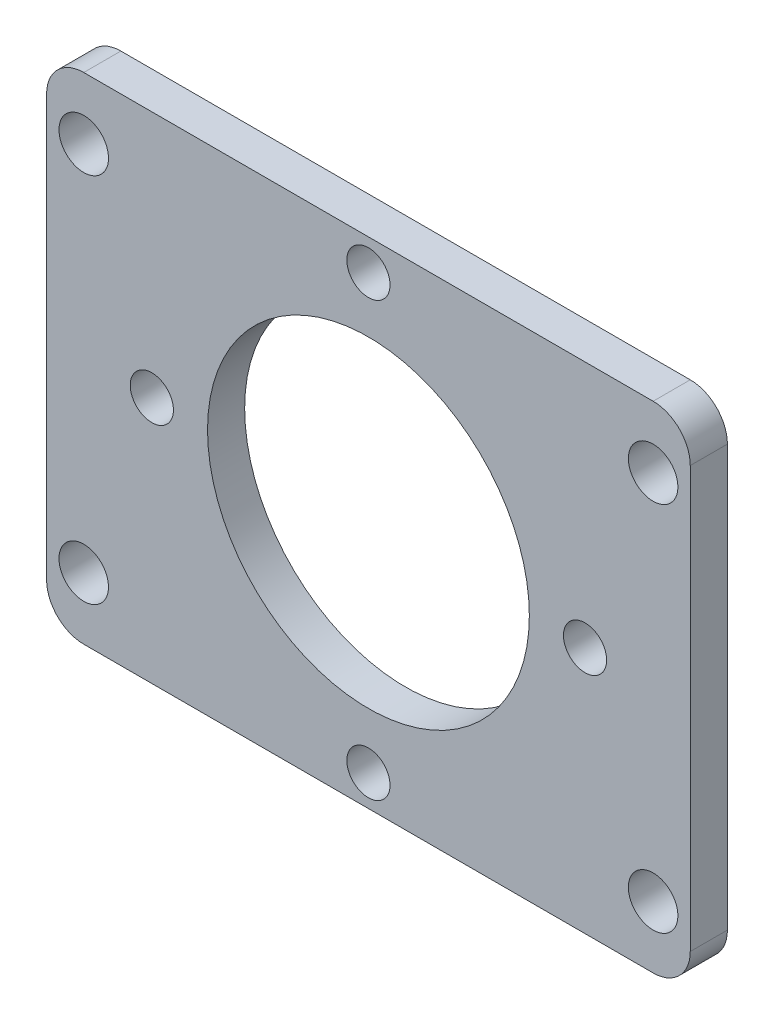
ISO-10303-21;
HEADER;
FILE_DESCRIPTION(('STEP AP214'),'2;1');
FILE_NAME('part.step','',(''),(''),'','','');
FILE_SCHEMA(('AUTOMOTIVE_DESIGN { 1 0 10303 214 1 1 1 1 }'));
ENDSEC;
DATA;
#1=APPLICATION_CONTEXT('core data for automotive mechanical design processes');
#2=APPLICATION_PROTOCOL_DEFINITION('international standard','automotive_design',2000,#1);
#3=PRODUCT_CONTEXT('',#1,'mechanical');
#4=PRODUCT('Part','Part','',(#3));
#5=PRODUCT_RELATED_PRODUCT_CATEGORY('part','',(#4));
#6=PRODUCT_DEFINITION_FORMATION('','',#4);
#7=PRODUCT_DEFINITION_CONTEXT('part definition',#1,'design');
#8=PRODUCT_DEFINITION('design','',#6,#7);
#9=PRODUCT_DEFINITION_SHAPE('','',#8);
#10=(LENGTH_UNIT() NAMED_UNIT(*) SI_UNIT(.MILLI.,.METRE.));
#11=(NAMED_UNIT(*) PLANE_ANGLE_UNIT() SI_UNIT($,.RADIAN.));
#12=(NAMED_UNIT(*) SI_UNIT($,.STERADIAN.) SOLID_ANGLE_UNIT());
#13=UNCERTAINTY_MEASURE_WITH_UNIT(LENGTH_MEASURE(1.E-05),#10,'distance_accuracy_value','');
#14=(GEOMETRIC_REPRESENTATION_CONTEXT(3) GLOBAL_UNCERTAINTY_ASSIGNED_CONTEXT((#13)) GLOBAL_UNIT_ASSIGNED_CONTEXT((#10,
#11,#12)) REPRESENTATION_CONTEXT('',''));
#15=CARTESIAN_POINT('',(0.,0.,0.));
#16=DIRECTION('',(0.,0.,1.));
#17=DIRECTION('',(1.,0.,0.));
#18=AXIS2_PLACEMENT_3D('',#15,#16,#17);
#19=CARTESIAN_POINT('',(0.,0.,3.));
#20=DIRECTION('',(0.,0.,1.));
#21=DIRECTION('',(1.,0.,0.));
#22=AXIS2_PLACEMENT_3D('',#19,#20,#21);
#23=PLANE('',#22);
#24=CARTESIAN_POINT('',(23.,-15.,3.));
#25=DIRECTION('',(0.,0.,1.));
#26=DIRECTION('',(1.,0.,0.));
#27=AXIS2_PLACEMENT_3D('',#24,#25,#26);
#28=CIRCLE('',#27,2.);
#29=CARTESIAN_POINT('',(25.,-15.,3.));
#30=VERTEX_POINT('',#29);
#31=EDGE_CURVE('E225',#30,#30,#28,.T.);
#32=ORIENTED_EDGE('',*,*,#31,.F.);
#33=EDGE_LOOP('',(#32));
#34=FACE_BOUND('',#33,.T.);
#35=CARTESIAN_POINT('',(-23.,15.,3.));
#36=DIRECTION('',(0.,0.,1.));
#37=DIRECTION('',(1.,0.,0.));
#38=AXIS2_PLACEMENT_3D('',#35,#36,#37);
#39=CIRCLE('',#38,2.);
#40=CARTESIAN_POINT('',(-21.,15.,3.));
#41=VERTEX_POINT('',#40);
#42=EDGE_CURVE('E213',#41,#41,#39,.T.);
#43=ORIENTED_EDGE('',*,*,#42,.F.);
#44=EDGE_LOOP('',(#43));
#45=FACE_BOUND('',#44,.T.);
#46=CARTESIAN_POINT('',(0.,-17.5,3.));
#47=DIRECTION('',(0.,0.,1.));
#48=DIRECTION('',(1.,0.,0.));
#49=AXIS2_PLACEMENT_3D('',#46,#47,#48);
#50=CIRCLE('',#49,1.74411619233284);
#51=CARTESIAN_POINT('',(1.74411619233284,-17.5,3.));
#52=VERTEX_POINT('',#51);
#53=EDGE_CURVE('E201',#52,#52,#50,.T.);
#54=ORIENTED_EDGE('',*,*,#53,.F.);
#55=EDGE_LOOP('',(#54));
#56=FACE_BOUND('',#55,.T.);
#57=CARTESIAN_POINT('',(0.,17.5,3.));
#58=DIRECTION('',(0.,0.,1.));
#59=DIRECTION('',(1.,0.,0.));
#60=AXIS2_PLACEMENT_3D('',#57,#58,#59);
#61=CIRCLE('',#60,1.74411619233273);
#62=CARTESIAN_POINT('',(1.74411619233273,17.5,3.));
#63=VERTEX_POINT('',#62);
#64=EDGE_CURVE('E189',#63,#63,#61,.T.);
#65=ORIENTED_EDGE('',*,*,#64,.F.);
#66=EDGE_LOOP('',(#65));
#67=FACE_BOUND('',#66,.T.);
#68=DIRECTION('',(0.,-1.,0.));
#69=VECTOR('',#68,1.);
#70=CARTESIAN_POINT('',(-26.,20.,3.));
#71=LINE('',#70,#69);
#72=CARTESIAN_POINT('',(-26.,17.,3.));
#73=VERTEX_POINT('',#72);
#74=CARTESIAN_POINT('',(-26.,-17.,3.));
#75=VERTEX_POINT('',#74);
#76=EDGE_CURVE('E143',#73,#75,#71,.T.);
#77=ORIENTED_EDGE('',*,*,#76,.T.);
#78=CARTESIAN_POINT('',(-23.,-17.,3.));
#79=DIRECTION('',(0.,0.,1.));
#80=DIRECTION('',(1.,0.,0.));
#81=AXIS2_PLACEMENT_3D('',#78,#79,#80);
#82=CIRCLE('',#81,3.);
#83=CARTESIAN_POINT('',(-23.,-20.,3.));
#84=VERTEX_POINT('',#83);
#85=EDGE_CURVE('E157',#75,#84,#82,.T.);
#86=ORIENTED_EDGE('',*,*,#85,.T.);
#87=DIRECTION('',(1.,0.,0.));
#88=VECTOR('',#87,1.);
#89=CARTESIAN_POINT('',(-26.,-20.,3.));
#90=LINE('',#89,#88);
#91=CARTESIAN_POINT('',(23.,-20.,3.));
#92=VERTEX_POINT('',#91);
#93=EDGE_CURVE('E124',#84,#92,#90,.T.);
#94=ORIENTED_EDGE('',*,*,#93,.T.);
#95=CARTESIAN_POINT('',(23.,-17.,3.));
#96=DIRECTION('',(0.,0.,1.));
#97=DIRECTION('',(1.,0.,0.));
#98=AXIS2_PLACEMENT_3D('',#95,#96,#97);
#99=CIRCLE('',#98,3.);
#100=CARTESIAN_POINT('',(26.,-17.,3.));
#101=VERTEX_POINT('',#100);
#102=EDGE_CURVE('E153',#92,#101,#99,.T.);
#103=ORIENTED_EDGE('',*,*,#102,.T.);
#104=DIRECTION('',(0.,1.,0.));
#105=VECTOR('',#104,1.);
#106=CARTESIAN_POINT('',(26.,20.,3.));
#107=LINE('',#106,#105);
#108=CARTESIAN_POINT('',(26.,17.,3.));
#109=VERTEX_POINT('',#108);
#110=EDGE_CURVE('E166',#101,#109,#107,.T.);
#111=ORIENTED_EDGE('',*,*,#110,.T.);
#112=CARTESIAN_POINT('',(23.,17.,3.));
#113=DIRECTION('',(0.,0.,1.));
#114=DIRECTION('',(1.,0.,0.));
#115=AXIS2_PLACEMENT_3D('',#112,#113,#114);
#116=CIRCLE('',#115,3.);
#117=CARTESIAN_POINT('',(23.,20.,3.));
#118=VERTEX_POINT('',#117);
#119=EDGE_CURVE('E59',#109,#118,#116,.T.);
#120=ORIENTED_EDGE('',*,*,#119,.T.);
#121=DIRECTION('',(-1.,0.,0.));
#122=VECTOR('',#121,1.);
#123=CARTESIAN_POINT('',(-26.,20.,3.));
#124=LINE('',#123,#122);
#125=CARTESIAN_POINT('',(-23.,20.,3.));
#126=VERTEX_POINT('',#125);
#127=EDGE_CURVE('E144',#118,#126,#124,.T.);
#128=ORIENTED_EDGE('',*,*,#127,.T.);
#129=CARTESIAN_POINT('',(-23.,17.,3.));
#130=DIRECTION('',(0.,0.,1.));
#131=DIRECTION('',(1.,0.,0.));
#132=AXIS2_PLACEMENT_3D('',#129,#130,#131);
#133=CIRCLE('',#132,3.);
#134=EDGE_CURVE('E155',#126,#73,#133,.T.);
#135=ORIENTED_EDGE('',*,*,#134,.T.);
#136=EDGE_LOOP('',(#77,#86,#94,#103,#111,#120,#128,#135));
#137=FACE_BOUND('',#136,.T.);
#138=CARTESIAN_POINT('',(0.,0.,3.));
#139=DIRECTION('',(0.,0.,1.));
#140=DIRECTION('',(1.,0.,0.));
#141=AXIS2_PLACEMENT_3D('',#138,#139,#140);
#142=CIRCLE('',#141,13.);
#143=CARTESIAN_POINT('',(13.,0.,3.));
#144=VERTEX_POINT('',#143);
#145=EDGE_CURVE('E138',#144,#144,#142,.T.);
#146=ORIENTED_EDGE('',*,*,#145,.F.);
#147=EDGE_LOOP('',(#146));
#148=FACE_BOUND('',#147,.T.);
#149=CARTESIAN_POINT('',(17.5,0.,3.));
#150=DIRECTION('',(0.,0.,1.));
#151=DIRECTION('',(1.,0.,0.));
#152=AXIS2_PLACEMENT_3D('',#149,#150,#151);
#153=CIRCLE('',#152,1.74411619233278);
#154=CARTESIAN_POINT('',(19.2441161923328,0.,3.));
#155=VERTEX_POINT('',#154);
#156=EDGE_CURVE('E195',#155,#155,#153,.T.);
#157=ORIENTED_EDGE('',*,*,#156,.F.);
#158=EDGE_LOOP('',(#157));
#159=FACE_BOUND('',#158,.T.);
#160=CARTESIAN_POINT('',(-17.5,0.,3.));
#161=DIRECTION('',(0.,0.,1.));
#162=DIRECTION('',(1.,0.,0.));
#163=AXIS2_PLACEMENT_3D('',#160,#161,#162);
#164=CIRCLE('',#163,1.74411619233273);
#165=CARTESIAN_POINT('',(-15.7558838076673,0.,3.));
#166=VERTEX_POINT('',#165);
#167=EDGE_CURVE('E207',#166,#166,#164,.T.);
#168=ORIENTED_EDGE('',*,*,#167,.F.);
#169=EDGE_LOOP('',(#168));
#170=FACE_BOUND('',#169,.T.);
#171=CARTESIAN_POINT('',(23.,15.,3.));
#172=DIRECTION('',(0.,0.,1.));
#173=DIRECTION('',(-1.,0.,0.));
#174=AXIS2_PLACEMENT_3D('',#171,#172,#173);
#175=CIRCLE('',#174,2.);
#176=CARTESIAN_POINT('',(21.,15.,3.));
#177=VERTEX_POINT('',#176);
#178=EDGE_CURVE('E219',#177,#177,#175,.T.);
#179=ORIENTED_EDGE('',*,*,#178,.F.);
#180=EDGE_LOOP('',(#179));
#181=FACE_BOUND('',#180,.T.);
#182=CARTESIAN_POINT('',(-23.,-15.,3.));
#183=DIRECTION('',(0.,0.,1.));
#184=DIRECTION('',(-1.,0.,0.));
#185=AXIS2_PLACEMENT_3D('',#182,#183,#184);
#186=CIRCLE('',#185,2.);
#187=CARTESIAN_POINT('',(-25.,-15.,3.));
#188=VERTEX_POINT('',#187);
#189=EDGE_CURVE('E231',#188,#188,#186,.T.);
#190=ORIENTED_EDGE('',*,*,#189,.F.);
#191=EDGE_LOOP('',(#190));
#192=FACE_BOUND('',#191,.T.);
#193=ADVANCED_FACE('F37',(#34,#45,#56,#67,#137,#148,#159,#170,#181,#192),#23,.T.);
#194=CARTESIAN_POINT('',(0.,0.,0.));
#195=DIRECTION('',(0.,0.,1.));
#196=DIRECTION('',(1.,0.,0.));
#197=AXIS2_PLACEMENT_3D('',#194,#195,#196);
#198=PLANE('',#197);
#199=DIRECTION('',(1.,0.,0.));
#200=VECTOR('',#199,1.);
#201=CARTESIAN_POINT('',(-26.,-20.,0.));
#202=LINE('',#201,#200);
#203=CARTESIAN_POINT('',(-23.,-20.,0.));
#204=VERTEX_POINT('',#203);
#205=CARTESIAN_POINT('',(23.,-20.,0.));
#206=VERTEX_POINT('',#205);
#207=EDGE_CURVE('E121',#204,#206,#202,.T.);
#208=ORIENTED_EDGE('',*,*,#207,.F.);
#209=CARTESIAN_POINT('',(-23.,-17.,0.));
#210=DIRECTION('',(0.,0.,1.));
#211=DIRECTION('',(1.,0.,0.));
#212=AXIS2_PLACEMENT_3D('',#209,#210,#211);
#213=CIRCLE('',#212,3.);
#214=CARTESIAN_POINT('',(-26.,-17.,0.));
#215=VERTEX_POINT('',#214);
#216=EDGE_CURVE('E104',#204,#215,#213,.F.);
#217=ORIENTED_EDGE('',*,*,#216,.T.);
#218=DIRECTION('',(0.,-1.,0.));
#219=VECTOR('',#218,1.);
#220=CARTESIAN_POINT('',(-26.,20.,0.));
#221=LINE('',#220,#219);
#222=CARTESIAN_POINT('',(-26.,17.,0.));
#223=VERTEX_POINT('',#222);
#224=EDGE_CURVE('E133',#223,#215,#221,.T.);
#225=ORIENTED_EDGE('',*,*,#224,.F.);
#226=CARTESIAN_POINT('',(-23.,17.,0.));
#227=DIRECTION('',(0.,0.,1.));
#228=DIRECTION('',(1.,0.,0.));
#229=AXIS2_PLACEMENT_3D('',#226,#227,#228);
#230=CIRCLE('',#229,3.);
#231=CARTESIAN_POINT('',(-23.,20.,0.));
#232=VERTEX_POINT('',#231);
#233=EDGE_CURVE('E115',#223,#232,#230,.F.);
#234=ORIENTED_EDGE('',*,*,#233,.T.);
#235=DIRECTION('',(-1.,0.,0.));
#236=VECTOR('',#235,1.);
#237=CARTESIAN_POINT('',(-26.,20.,0.));
#238=LINE('',#237,#236);
#239=CARTESIAN_POINT('',(23.,20.,0.));
#240=VERTEX_POINT('',#239);
#241=EDGE_CURVE('E136',#240,#232,#238,.T.);
#242=ORIENTED_EDGE('',*,*,#241,.F.);
#243=CARTESIAN_POINT('',(23.,17.,0.));
#244=DIRECTION('',(0.,0.,1.));
#245=DIRECTION('',(1.,0.,0.));
#246=AXIS2_PLACEMENT_3D('',#243,#244,#245);
#247=CIRCLE('',#246,3.);
#248=CARTESIAN_POINT('',(26.,17.,0.));
#249=VERTEX_POINT('',#248);
#250=EDGE_CURVE('E125',#240,#249,#247,.F.);
#251=ORIENTED_EDGE('',*,*,#250,.T.);
#252=DIRECTION('',(0.,1.,0.));
#253=VECTOR('',#252,1.);
#254=CARTESIAN_POINT('',(26.,20.,0.));
#255=LINE('',#254,#253);
#256=CARTESIAN_POINT('',(26.,-17.,0.));
#257=VERTEX_POINT('',#256);
#258=EDGE_CURVE('E132',#257,#249,#255,.T.);
#259=ORIENTED_EDGE('',*,*,#258,.F.);
#260=CARTESIAN_POINT('',(23.,-17.,0.));
#261=DIRECTION('',(0.,0.,1.));
#262=DIRECTION('',(1.,0.,0.));
#263=AXIS2_PLACEMENT_3D('',#260,#261,#262);
#264=CIRCLE('',#263,3.);
#265=EDGE_CURVE('E131',#257,#206,#264,.F.);
#266=ORIENTED_EDGE('',*,*,#265,.T.);
#267=EDGE_LOOP('',(#208,#217,#225,#234,#242,#251,#259,#266));
#268=FACE_BOUND('',#267,.T.);
#269=CARTESIAN_POINT('',(0.,0.,0.));
#270=DIRECTION('',(0.,0.,1.));
#271=DIRECTION('',(1.,0.,0.));
#272=AXIS2_PLACEMENT_3D('',#269,#270,#271);
#273=CIRCLE('',#272,13.);
#274=CARTESIAN_POINT('',(13.,0.,0.));
#275=VERTEX_POINT('',#274);
#276=EDGE_CURVE('E186',#275,#275,#273,.T.);
#277=ORIENTED_EDGE('',*,*,#276,.T.);
#278=EDGE_LOOP('',(#277));
#279=FACE_BOUND('',#278,.T.);
#280=CARTESIAN_POINT('',(0.,17.5,0.));
#281=DIRECTION('',(0.,0.,1.));
#282=DIRECTION('',(1.,0.,0.));
#283=AXIS2_PLACEMENT_3D('',#280,#281,#282);
#284=CIRCLE('',#283,1.74411619233273);
#285=CARTESIAN_POINT('',(1.74411619233273,17.5,0.));
#286=VERTEX_POINT('',#285);
#287=EDGE_CURVE('E192',#286,#286,#284,.T.);
#288=ORIENTED_EDGE('',*,*,#287,.T.);
#289=EDGE_LOOP('',(#288));
#290=FACE_BOUND('',#289,.T.);
#291=CARTESIAN_POINT('',(17.5,0.,0.));
#292=DIRECTION('',(0.,0.,1.));
#293=DIRECTION('',(1.,0.,0.));
#294=AXIS2_PLACEMENT_3D('',#291,#292,#293);
#295=CIRCLE('',#294,1.74411619233278);
#296=CARTESIAN_POINT('',(19.2441161923328,0.,0.));
#297=VERTEX_POINT('',#296);
#298=EDGE_CURVE('E198',#297,#297,#295,.T.);
#299=ORIENTED_EDGE('',*,*,#298,.T.);
#300=EDGE_LOOP('',(#299));
#301=FACE_BOUND('',#300,.T.);
#302=CARTESIAN_POINT('',(0.,-17.5,0.));
#303=DIRECTION('',(0.,0.,1.));
#304=DIRECTION('',(1.,0.,0.));
#305=AXIS2_PLACEMENT_3D('',#302,#303,#304);
#306=CIRCLE('',#305,1.74411619233284);
#307=CARTESIAN_POINT('',(1.74411619233284,-17.5,0.));
#308=VERTEX_POINT('',#307);
#309=EDGE_CURVE('E204',#308,#308,#306,.T.);
#310=ORIENTED_EDGE('',*,*,#309,.T.);
#311=EDGE_LOOP('',(#310));
#312=FACE_BOUND('',#311,.T.);
#313=CARTESIAN_POINT('',(-17.5,0.,0.));
#314=DIRECTION('',(0.,0.,1.));
#315=DIRECTION('',(1.,0.,0.));
#316=AXIS2_PLACEMENT_3D('',#313,#314,#315);
#317=CIRCLE('',#316,1.74411619233273);
#318=CARTESIAN_POINT('',(-15.7558838076673,0.,0.));
#319=VERTEX_POINT('',#318);
#320=EDGE_CURVE('E210',#319,#319,#317,.T.);
#321=ORIENTED_EDGE('',*,*,#320,.T.);
#322=EDGE_LOOP('',(#321));
#323=FACE_BOUND('',#322,.T.);
#324=CARTESIAN_POINT('',(-23.,15.,0.));
#325=DIRECTION('',(0.,0.,1.));
#326=DIRECTION('',(1.,0.,0.));
#327=AXIS2_PLACEMENT_3D('',#324,#325,#326);
#328=CIRCLE('',#327,2.);
#329=CARTESIAN_POINT('',(-21.,15.,0.));
#330=VERTEX_POINT('',#329);
#331=EDGE_CURVE('E216',#330,#330,#328,.T.);
#332=ORIENTED_EDGE('',*,*,#331,.T.);
#333=EDGE_LOOP('',(#332));
#334=FACE_BOUND('',#333,.T.);
#335=CARTESIAN_POINT('',(23.,15.,0.));
#336=DIRECTION('',(0.,0.,1.));
#337=DIRECTION('',(-1.,0.,0.));
#338=AXIS2_PLACEMENT_3D('',#335,#336,#337);
#339=CIRCLE('',#338,2.);
#340=CARTESIAN_POINT('',(21.,15.,0.));
#341=VERTEX_POINT('',#340);
#342=EDGE_CURVE('E222',#341,#341,#339,.T.);
#343=ORIENTED_EDGE('',*,*,#342,.T.);
#344=EDGE_LOOP('',(#343));
#345=FACE_BOUND('',#344,.T.);
#346=CARTESIAN_POINT('',(23.,-15.,0.));
#347=DIRECTION('',(0.,0.,1.));
#348=DIRECTION('',(1.,0.,0.));
#349=AXIS2_PLACEMENT_3D('',#346,#347,#348);
#350=CIRCLE('',#349,2.);
#351=CARTESIAN_POINT('',(25.,-15.,0.));
#352=VERTEX_POINT('',#351);
#353=EDGE_CURVE('E228',#352,#352,#350,.T.);
#354=ORIENTED_EDGE('',*,*,#353,.T.);
#355=EDGE_LOOP('',(#354));
#356=FACE_BOUND('',#355,.T.);
#357=CARTESIAN_POINT('',(-23.,-15.,0.));
#358=DIRECTION('',(0.,0.,1.));
#359=DIRECTION('',(-1.,0.,0.));
#360=AXIS2_PLACEMENT_3D('',#357,#358,#359);
#361=CIRCLE('',#360,2.);
#362=CARTESIAN_POINT('',(-25.,-15.,0.));
#363=VERTEX_POINT('',#362);
#364=EDGE_CURVE('E234',#363,#363,#361,.T.);
#365=ORIENTED_EDGE('',*,*,#364,.T.);
#366=EDGE_LOOP('',(#365));
#367=FACE_BOUND('',#366,.T.);
#368=ADVANCED_FACE('F128',(#268,#279,#290,#301,#312,#323,#334,#345,#356,#367),#198,.F.);
#369=CARTESIAN_POINT('',(-26.,20.,3.));
#370=DIRECTION('',(1.,0.,0.));
#371=DIRECTION('',(0.,1.,0.));
#372=AXIS2_PLACEMENT_3D('',#369,#370,#371);
#373=PLANE('',#372);
#374=ORIENTED_EDGE('',*,*,#224,.T.);
#375=DIRECTION('',(0.,0.,-1.));
#376=VECTOR('',#375,1.);
#377=CARTESIAN_POINT('',(-26.,-17.,3.));
#378=LINE('',#377,#376);
#379=EDGE_CURVE('E109',#215,#75,#378,.F.);
#380=ORIENTED_EDGE('',*,*,#379,.T.);
#381=ORIENTED_EDGE('',*,*,#76,.F.);
#382=DIRECTION('',(0.,0.,-1.));
#383=VECTOR('',#382,1.);
#384=CARTESIAN_POINT('',(-26.,17.,3.));
#385=LINE('',#384,#383);
#386=EDGE_CURVE('E114',#73,#223,#385,.T.);
#387=ORIENTED_EDGE('',*,*,#386,.T.);
#388=EDGE_LOOP('',(#374,#380,#381,#387));
#389=FACE_BOUND('',#388,.T.);
#390=ADVANCED_FACE('F182',(#389),#373,.F.);
#391=CARTESIAN_POINT('',(-26.,-20.,3.));
#392=DIRECTION('',(0.,1.,0.));
#393=DIRECTION('',(0.,0.,1.));
#394=AXIS2_PLACEMENT_3D('',#391,#392,#393);
#395=PLANE('',#394);
#396=ORIENTED_EDGE('',*,*,#93,.F.);
#397=DIRECTION('',(0.,0.,-1.));
#398=VECTOR('',#397,1.);
#399=CARTESIAN_POINT('',(-23.,-20.,3.));
#400=LINE('',#399,#398);
#401=EDGE_CURVE('E108',#84,#204,#400,.T.);
#402=ORIENTED_EDGE('',*,*,#401,.T.);
#403=ORIENTED_EDGE('',*,*,#207,.T.);
#404=DIRECTION('',(0.,0.,-1.));
#405=VECTOR('',#404,1.);
#406=CARTESIAN_POINT('',(23.,-20.,3.));
#407=LINE('',#406,#405);
#408=EDGE_CURVE('E126',#206,#92,#407,.F.);
#409=ORIENTED_EDGE('',*,*,#408,.T.);
#410=EDGE_LOOP('',(#396,#402,#403,#409));
#411=FACE_BOUND('',#410,.T.);
#412=ADVANCED_FACE('F120',(#411),#395,.F.);
#413=CARTESIAN_POINT('',(26.,20.,3.));
#414=DIRECTION('',(-1.,0.,0.));
#415=DIRECTION('',(0.,-1.,0.));
#416=AXIS2_PLACEMENT_3D('',#413,#414,#415);
#417=PLANE('',#416);
#418=ORIENTED_EDGE('',*,*,#110,.F.);
#419=DIRECTION('',(0.,0.,-1.));
#420=VECTOR('',#419,1.);
#421=CARTESIAN_POINT('',(26.,-17.,3.));
#422=LINE('',#421,#420);
#423=EDGE_CURVE('E11',#101,#257,#422,.T.);
#424=ORIENTED_EDGE('',*,*,#423,.T.);
#425=ORIENTED_EDGE('',*,*,#258,.T.);
#426=DIRECTION('',(0.,0.,-1.));
#427=VECTOR('',#426,1.);
#428=CARTESIAN_POINT('',(26.,17.,3.));
#429=LINE('',#428,#427);
#430=EDGE_CURVE('E45',#249,#109,#429,.F.);
#431=ORIENTED_EDGE('',*,*,#430,.T.);
#432=EDGE_LOOP('',(#418,#424,#425,#431));
#433=FACE_BOUND('',#432,.T.);
#434=ADVANCED_FACE('F165',(#433),#417,.F.);
#435=CARTESIAN_POINT('',(-26.,20.,3.));
#436=DIRECTION('',(0.,-1.,0.));
#437=DIRECTION('',(0.,0.,-1.));
#438=AXIS2_PLACEMENT_3D('',#435,#436,#437);
#439=PLANE('',#438);
#440=ORIENTED_EDGE('',*,*,#241,.T.);
#441=DIRECTION('',(0.,0.,-1.));
#442=VECTOR('',#441,1.);
#443=CARTESIAN_POINT('',(-23.,20.,3.));
#444=LINE('',#443,#442);
#445=EDGE_CURVE('E52',#232,#126,#444,.F.);
#446=ORIENTED_EDGE('',*,*,#445,.T.);
#447=ORIENTED_EDGE('',*,*,#127,.F.);
#448=DIRECTION('',(0.,0.,-1.));
#449=VECTOR('',#448,1.);
#450=CARTESIAN_POINT('',(23.,20.,3.));
#451=LINE('',#450,#449);
#452=EDGE_CURVE('E159',#118,#240,#451,.T.);
#453=ORIENTED_EDGE('',*,*,#452,.T.);
#454=EDGE_LOOP('',(#440,#446,#447,#453));
#455=FACE_BOUND('',#454,.T.);
#456=ADVANCED_FACE('F175',(#455),#439,.F.);
#457=CARTESIAN_POINT('',(0.,0.,3.));
#458=DIRECTION('',(0.,0.,-1.));
#459=DIRECTION('',(-1.,0.,0.));
#460=AXIS2_PLACEMENT_3D('',#457,#458,#459);
#461=CYLINDRICAL_SURFACE('',#460,13.);
#462=ORIENTED_EDGE('',*,*,#145,.T.);
#463=EDGE_LOOP('',(#462));
#464=FACE_BOUND('',#463,.T.);
#465=ORIENTED_EDGE('',*,*,#276,.F.);
#466=EDGE_LOOP('',(#465));
#467=FACE_BOUND('',#466,.T.);
#468=ADVANCED_FACE('F253',(#464,#467),#461,.F.);
#469=CARTESIAN_POINT('',(0.,17.5,3.));
#470=DIRECTION('',(0.,0.,-1.));
#471=DIRECTION('',(-1.,0.,0.));
#472=AXIS2_PLACEMENT_3D('',#469,#470,#471);
#473=CYLINDRICAL_SURFACE('',#472,1.74411619233273);
#474=ORIENTED_EDGE('',*,*,#64,.T.);
#475=EDGE_LOOP('',(#474));
#476=FACE_BOUND('',#475,.T.);
#477=ORIENTED_EDGE('',*,*,#287,.F.);
#478=EDGE_LOOP('',(#477));
#479=FACE_BOUND('',#478,.T.);
#480=ADVANCED_FACE('F395',(#476,#479),#473,.F.);
#481=CARTESIAN_POINT('',(17.5,0.,3.));
#482=DIRECTION('',(0.,0.,-1.));
#483=DIRECTION('',(-1.,0.,0.));
#484=AXIS2_PLACEMENT_3D('',#481,#482,#483);
#485=CYLINDRICAL_SURFACE('',#484,1.74411619233278);
#486=ORIENTED_EDGE('',*,*,#156,.T.);
#487=EDGE_LOOP('',(#486));
#488=FACE_BOUND('',#487,.T.);
#489=ORIENTED_EDGE('',*,*,#298,.F.);
#490=EDGE_LOOP('',(#489));
#491=FACE_BOUND('',#490,.T.);
#492=ADVANCED_FACE('F385',(#488,#491),#485,.F.);
#493=CARTESIAN_POINT('',(0.,-17.5,3.));
#494=DIRECTION('',(0.,0.,-1.));
#495=DIRECTION('',(-1.,0.,0.));
#496=AXIS2_PLACEMENT_3D('',#493,#494,#495);
#497=CYLINDRICAL_SURFACE('',#496,1.74411619233284);
#498=ORIENTED_EDGE('',*,*,#53,.T.);
#499=EDGE_LOOP('',(#498));
#500=FACE_BOUND('',#499,.T.);
#501=ORIENTED_EDGE('',*,*,#309,.F.);
#502=EDGE_LOOP('',(#501));
#503=FACE_BOUND('',#502,.T.);
#504=ADVANCED_FACE('F375',(#500,#503),#497,.F.);
#505=CARTESIAN_POINT('',(-17.5,0.,3.));
#506=DIRECTION('',(0.,0.,-1.));
#507=DIRECTION('',(-1.,0.,0.));
#508=AXIS2_PLACEMENT_3D('',#505,#506,#507);
#509=CYLINDRICAL_SURFACE('',#508,1.74411619233273);
#510=ORIENTED_EDGE('',*,*,#167,.T.);
#511=EDGE_LOOP('',(#510));
#512=FACE_BOUND('',#511,.T.);
#513=ORIENTED_EDGE('',*,*,#320,.F.);
#514=EDGE_LOOP('',(#513));
#515=FACE_BOUND('',#514,.T.);
#516=ADVANCED_FACE('F365',(#512,#515),#509,.F.);
#517=CARTESIAN_POINT('',(-23.,15.,3.));
#518=DIRECTION('',(0.,0.,-1.));
#519=DIRECTION('',(-1.,0.,0.));
#520=AXIS2_PLACEMENT_3D('',#517,#518,#519);
#521=CYLINDRICAL_SURFACE('',#520,2.);
#522=ORIENTED_EDGE('',*,*,#42,.T.);
#523=EDGE_LOOP('',(#522));
#524=FACE_BOUND('',#523,.T.);
#525=ORIENTED_EDGE('',*,*,#331,.F.);
#526=EDGE_LOOP('',(#525));
#527=FACE_BOUND('',#526,.T.);
#528=ADVANCED_FACE('F355',(#524,#527),#521,.F.);
#529=CARTESIAN_POINT('',(23.,15.,3.));
#530=DIRECTION('',(0.,0.,-1.));
#531=DIRECTION('',(-1.,0.,0.));
#532=AXIS2_PLACEMENT_3D('',#529,#530,#531);
#533=CYLINDRICAL_SURFACE('',#532,2.);
#534=ORIENTED_EDGE('',*,*,#178,.T.);
#535=EDGE_LOOP('',(#534));
#536=FACE_BOUND('',#535,.T.);
#537=ORIENTED_EDGE('',*,*,#342,.F.);
#538=EDGE_LOOP('',(#537));
#539=FACE_BOUND('',#538,.T.);
#540=ADVANCED_FACE('F345',(#536,#539),#533,.F.);
#541=CARTESIAN_POINT('',(23.,-15.,3.));
#542=DIRECTION('',(0.,0.,-1.));
#543=DIRECTION('',(-1.,0.,0.));
#544=AXIS2_PLACEMENT_3D('',#541,#542,#543);
#545=CYLINDRICAL_SURFACE('',#544,2.);
#546=ORIENTED_EDGE('',*,*,#31,.T.);
#547=EDGE_LOOP('',(#546));
#548=FACE_BOUND('',#547,.T.);
#549=ORIENTED_EDGE('',*,*,#353,.F.);
#550=EDGE_LOOP('',(#549));
#551=FACE_BOUND('',#550,.T.);
#552=ADVANCED_FACE('F336',(#548,#551),#545,.F.);
#553=CARTESIAN_POINT('',(-23.,-15.,3.));
#554=DIRECTION('',(0.,0.,-1.));
#555=DIRECTION('',(-1.,0.,0.));
#556=AXIS2_PLACEMENT_3D('',#553,#554,#555);
#557=CYLINDRICAL_SURFACE('',#556,2.);
#558=ORIENTED_EDGE('',*,*,#189,.T.);
#559=EDGE_LOOP('',(#558));
#560=FACE_BOUND('',#559,.T.);
#561=ORIENTED_EDGE('',*,*,#364,.F.);
#562=EDGE_LOOP('',(#561));
#563=FACE_BOUND('',#562,.T.);
#564=ADVANCED_FACE('F240',(#560,#563),#557,.F.);
#565=CARTESIAN_POINT('',(-23.,-17.,3.));
#566=DIRECTION('',(0.,0.,-1.));
#567=DIRECTION('',(-1.,0.,0.));
#568=AXIS2_PLACEMENT_3D('',#565,#566,#567);
#569=CYLINDRICAL_SURFACE('',#568,3.);
#570=ORIENTED_EDGE('',*,*,#85,.F.);
#571=ORIENTED_EDGE('',*,*,#379,.F.);
#572=ORIENTED_EDGE('',*,*,#216,.F.);
#573=ORIENTED_EDGE('',*,*,#401,.F.);
#574=EDGE_LOOP('',(#570,#571,#572,#573));
#575=FACE_BOUND('',#574,.T.);
#576=ADVANCED_FACE('F107',(#575),#569,.T.);
#577=CARTESIAN_POINT('',(-23.,17.,3.));
#578=DIRECTION('',(0.,0.,-1.));
#579=DIRECTION('',(-1.,0.,0.));
#580=AXIS2_PLACEMENT_3D('',#577,#578,#579);
#581=CYLINDRICAL_SURFACE('',#580,3.);
#582=ORIENTED_EDGE('',*,*,#134,.F.);
#583=ORIENTED_EDGE('',*,*,#445,.F.);
#584=ORIENTED_EDGE('',*,*,#233,.F.);
#585=ORIENTED_EDGE('',*,*,#386,.F.);
#586=EDGE_LOOP('',(#582,#583,#584,#585));
#587=FACE_BOUND('',#586,.T.);
#588=ADVANCED_FACE('F179',(#587),#581,.T.);
#589=CARTESIAN_POINT('',(23.,-17.,3.));
#590=DIRECTION('',(0.,0.,-1.));
#591=DIRECTION('',(-1.,0.,0.));
#592=AXIS2_PLACEMENT_3D('',#589,#590,#591);
#593=CYLINDRICAL_SURFACE('',#592,3.);
#594=ORIENTED_EDGE('',*,*,#102,.F.);
#595=ORIENTED_EDGE('',*,*,#408,.F.);
#596=ORIENTED_EDGE('',*,*,#265,.F.);
#597=ORIENTED_EDGE('',*,*,#423,.F.);
#598=EDGE_LOOP('',(#594,#595,#596,#597));
#599=FACE_BOUND('',#598,.T.);
#600=ADVANCED_FACE('F267',(#599),#593,.T.);
#601=CARTESIAN_POINT('',(23.,17.,3.));
#602=DIRECTION('',(0.,0.,-1.));
#603=DIRECTION('',(-1.,0.,0.));
#604=AXIS2_PLACEMENT_3D('',#601,#602,#603);
#605=CYLINDRICAL_SURFACE('',#604,3.);
#606=ORIENTED_EDGE('',*,*,#119,.F.);
#607=ORIENTED_EDGE('',*,*,#430,.F.);
#608=ORIENTED_EDGE('',*,*,#250,.F.);
#609=ORIENTED_EDGE('',*,*,#452,.F.);
#610=EDGE_LOOP('',(#606,#607,#608,#609));
#611=FACE_BOUND('',#610,.T.);
#612=ADVANCED_FACE('F39',(#611),#605,.T.);
#613=CLOSED_SHELL('',(#193,#368,#390,#412,#434,#456,#468,#480,#492,#504,#516,#528,#540,#552,
#564,#576,#588,#600,#612));
#614=MANIFOLD_SOLID_BREP('B2',#613);
#615=ADVANCED_BREP_SHAPE_REPRESENTATION('',(#18,#614),#14);
#616=SHAPE_DEFINITION_REPRESENTATION(#9,#615);
ENDSEC;
END-ISO-10303-21;
